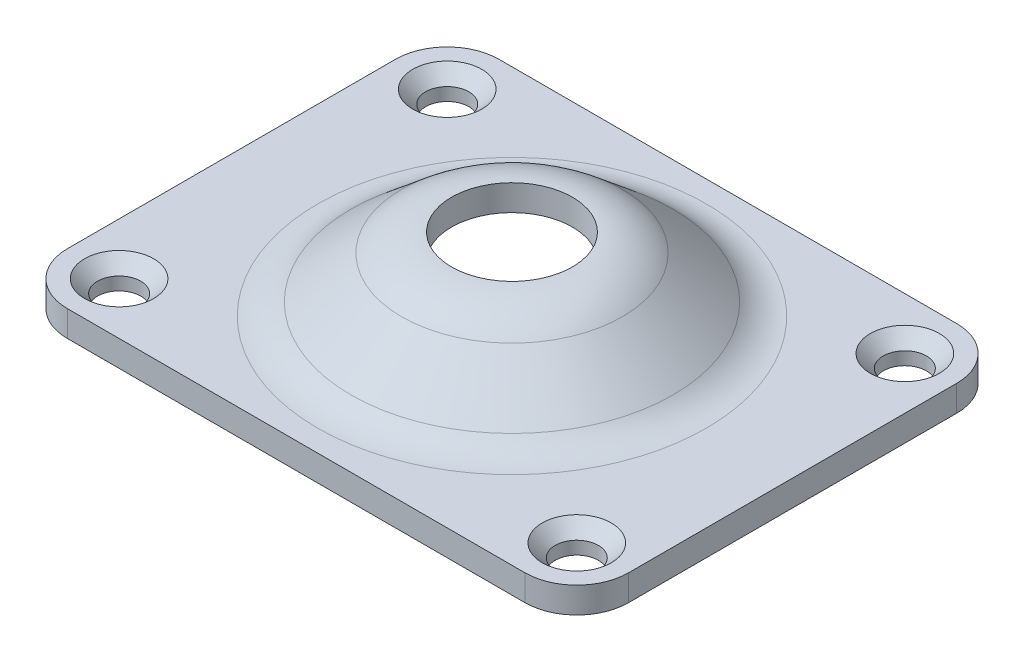
ISO-10303-21;
HEADER;
FILE_DESCRIPTION(('STEP AP214'),'2;1');
FILE_NAME('part.step','',(''),(''),'','','');
FILE_SCHEMA(('AUTOMOTIVE_DESIGN { 1 0 10303 214 1 1 1 1 }'));
ENDSEC;
DATA;
#1=APPLICATION_CONTEXT('core data for automotive mechanical design processes');
#2=APPLICATION_PROTOCOL_DEFINITION('international standard','automotive_design',2000,#1);
#3=PRODUCT_CONTEXT('',#1,'mechanical');
#4=PRODUCT('Part','Part','',(#3));
#5=PRODUCT_RELATED_PRODUCT_CATEGORY('part','',(#4));
#6=PRODUCT_DEFINITION_FORMATION('','',#4);
#7=PRODUCT_DEFINITION_CONTEXT('part definition',#1,'design');
#8=PRODUCT_DEFINITION('design','',#6,#7);
#9=PRODUCT_DEFINITION_SHAPE('','',#8);
#10=(LENGTH_UNIT() NAMED_UNIT(*) SI_UNIT(.MILLI.,.METRE.));
#11=(NAMED_UNIT(*) PLANE_ANGLE_UNIT() SI_UNIT($,.RADIAN.));
#12=(NAMED_UNIT(*) SI_UNIT($,.STERADIAN.) SOLID_ANGLE_UNIT());
#13=UNCERTAINTY_MEASURE_WITH_UNIT(LENGTH_MEASURE(1.E-05),#10,'distance_accuracy_value','');
#14=(GEOMETRIC_REPRESENTATION_CONTEXT(3) GLOBAL_UNCERTAINTY_ASSIGNED_CONTEXT((#13)) GLOBAL_UNIT_ASSIGNED_CONTEXT((#10,
#11,#12)) REPRESENTATION_CONTEXT('',''));
#15=CARTESIAN_POINT('',(0.,0.,0.));
#16=DIRECTION('',(0.,0.,1.));
#17=DIRECTION('',(1.,0.,0.));
#18=AXIS2_PLACEMENT_3D('',#15,#16,#17);
#19=CARTESIAN_POINT('',(26.5,3.,-19.));
#20=DIRECTION('',(0.,-1.,0.));
#21=DIRECTION('',(0.,0.,-1.));
#22=AXIS2_PLACEMENT_3D('',#19,#20,#21);
#23=PLANE('',#22);
#24=CARTESIAN_POINT('',(26.5,3.,19.));
#25=DIRECTION('',(0.,-1.,0.));
#26=DIRECTION('',(0.,0.,-1.));
#27=AXIS2_PLACEMENT_3D('',#24,#25,#26);
#28=CIRCLE('',#27,3.99999999999999);
#29=CARTESIAN_POINT('',(26.5,3.,23.));
#30=VERTEX_POINT('',#29);
#31=EDGE_CURVE('E174',#30,#30,#28,.T.);
#32=ORIENTED_EDGE('',*,*,#31,.T.);
#33=EDGE_LOOP('',(#32));
#34=FACE_BOUND('',#33,.T.);
#35=CARTESIAN_POINT('',(26.5,3.,-19.));
#36=DIRECTION('',(0.,-1.,0.));
#37=DIRECTION('',(0.,0.,-1.));
#38=AXIS2_PLACEMENT_3D('',#35,#36,#37);
#39=CIRCLE('',#38,3.99999999999999);
#40=CARTESIAN_POINT('',(26.5,3.,-15.));
#41=VERTEX_POINT('',#40);
#42=EDGE_CURVE('E171',#41,#41,#39,.T.);
#43=ORIENTED_EDGE('',*,*,#42,.T.);
#44=EDGE_LOOP('',(#43));
#45=FACE_BOUND('',#44,.T.);
#46=CARTESIAN_POINT('',(-26.5,3.,19.));
#47=DIRECTION('',(0.,-1.,0.));
#48=DIRECTION('',(0.,0.,-1.));
#49=AXIS2_PLACEMENT_3D('',#46,#47,#48);
#50=CIRCLE('',#49,3.99999999999999);
#51=CARTESIAN_POINT('',(-26.5,3.,23.));
#52=VERTEX_POINT('',#51);
#53=EDGE_CURVE('E168',#52,#52,#50,.T.);
#54=ORIENTED_EDGE('',*,*,#53,.T.);
#55=EDGE_LOOP('',(#54));
#56=FACE_BOUND('',#55,.T.);
#57=CARTESIAN_POINT('',(-26.5,3.,-19.));
#58=DIRECTION('',(0.,-1.,0.));
#59=DIRECTION('',(0.,0.,-1.));
#60=AXIS2_PLACEMENT_3D('',#57,#58,#59);
#61=CIRCLE('',#60,3.99999999999999);
#62=CARTESIAN_POINT('',(-26.5,3.,-15.));
#63=VERTEX_POINT('',#62);
#64=EDGE_CURVE('E165',#63,#63,#61,.T.);
#65=ORIENTED_EDGE('',*,*,#64,.T.);
#66=EDGE_LOOP('',(#65));
#67=FACE_BOUND('',#66,.T.);
#68=CARTESIAN_POINT('',(26.5,3.,-19.));
#69=DIRECTION('',(0.,1.,0.));
#70=DIRECTION('',(0.,0.,-1.));
#71=AXIS2_PLACEMENT_3D('',#68,#69,#70);
#72=CIRCLE('',#71,6.);
#73=CARTESIAN_POINT('',(32.5,3.,-19.));
#74=VERTEX_POINT('',#73);
#75=CARTESIAN_POINT('',(26.5,3.,-25.));
#76=VERTEX_POINT('',#75);
#77=EDGE_CURVE('E147',#74,#76,#72,.T.);
#78=ORIENTED_EDGE('',*,*,#77,.T.);
#79=DIRECTION('',(-1.,0.,0.));
#80=VECTOR('',#79,1.);
#81=CARTESIAN_POINT('',(-26.5,3.,-25.));
#82=LINE('',#81,#80);
#83=CARTESIAN_POINT('',(-26.5,3.,-25.));
#84=VERTEX_POINT('',#83);
#85=EDGE_CURVE('E95',#76,#84,#82,.T.);
#86=ORIENTED_EDGE('',*,*,#85,.T.);
#87=CARTESIAN_POINT('',(-26.5,3.,-19.));
#88=DIRECTION('',(0.,1.,0.));
#89=DIRECTION('',(0.,0.,-1.));
#90=AXIS2_PLACEMENT_3D('',#87,#88,#89);
#91=CIRCLE('',#90,6.);
#92=CARTESIAN_POINT('',(-32.5,3.,-19.));
#93=VERTEX_POINT('',#92);
#94=EDGE_CURVE('E277',#84,#93,#91,.T.);
#95=ORIENTED_EDGE('',*,*,#94,.T.);
#96=DIRECTION('',(0.,0.,1.));
#97=VECTOR('',#96,1.);
#98=CARTESIAN_POINT('',(-32.5,3.,-19.));
#99=LINE('',#98,#97);
#100=CARTESIAN_POINT('',(-32.5,3.,19.));
#101=VERTEX_POINT('',#100);
#102=EDGE_CURVE('E279',#93,#101,#99,.T.);
#103=ORIENTED_EDGE('',*,*,#102,.T.);
#104=CARTESIAN_POINT('',(-26.5,3.,19.));
#105=DIRECTION('',(0.,1.,0.));
#106=DIRECTION('',(0.,0.,1.));
#107=AXIS2_PLACEMENT_3D('',#104,#105,#106);
#108=CIRCLE('',#107,5.99999999999999);
#109=CARTESIAN_POINT('',(-26.5,3.,25.));
#110=VERTEX_POINT('',#109);
#111=EDGE_CURVE('E114',#101,#110,#108,.T.);
#112=ORIENTED_EDGE('',*,*,#111,.T.);
#113=DIRECTION('',(1.,0.,0.));
#114=VECTOR('',#113,1.);
#115=CARTESIAN_POINT('',(-26.5,3.,25.));
#116=LINE('',#115,#114);
#117=CARTESIAN_POINT('',(26.5,3.,25.));
#118=VERTEX_POINT('',#117);
#119=EDGE_CURVE('E108',#110,#118,#116,.T.);
#120=ORIENTED_EDGE('',*,*,#119,.T.);
#121=CARTESIAN_POINT('',(26.5,3.,19.));
#122=DIRECTION('',(0.,1.,0.));
#123=DIRECTION('',(0.,0.,-1.));
#124=AXIS2_PLACEMENT_3D('',#121,#122,#123);
#125=CIRCLE('',#124,6.);
#126=CARTESIAN_POINT('',(32.5,3.,19.));
#127=VERTEX_POINT('',#126);
#128=EDGE_CURVE('E112',#118,#127,#125,.T.);
#129=ORIENTED_EDGE('',*,*,#128,.T.);
#130=DIRECTION('',(0.,0.,-1.));
#131=VECTOR('',#130,1.);
#132=CARTESIAN_POINT('',(32.5,3.,-19.));
#133=LINE('',#132,#131);
#134=EDGE_CURVE('E51',#127,#74,#133,.T.);
#135=ORIENTED_EDGE('',*,*,#134,.T.);
#136=EDGE_LOOP('',(#78,#86,#95,#103,#112,#120,#129,#135));
#137=FACE_BOUND('',#136,.T.);
#138=CARTESIAN_POINT('',(0.,3.,0.));
#139=DIRECTION('',(0.,1.,0.));
#140=DIRECTION('',(0.,0.,1.));
#141=AXIS2_PLACEMENT_3D('',#138,#139,#140);
#142=CIRCLE('',#141,22.5);
#143=CARTESIAN_POINT('',(0.,3.,22.5));
#144=VERTEX_POINT('',#143);
#145=EDGE_CURVE('E261',#144,#144,#142,.T.);
#146=ORIENTED_EDGE('',*,*,#145,.F.);
#147=EDGE_LOOP('',(#146));
#148=FACE_BOUND('',#147,.T.);
#149=ADVANCED_FACE('F34',(#34,#45,#56,#67,#137,#148),#23,.F.);
#150=CARTESIAN_POINT('',(26.5,0.,-19.));
#151=DIRECTION('',(0.,-1.,0.));
#152=DIRECTION('',(0.,0.,-1.));
#153=AXIS2_PLACEMENT_3D('',#150,#151,#152);
#154=PLANE('',#153);
#155=CARTESIAN_POINT('',(26.5,0.,19.));
#156=DIRECTION('',(0.,1.,0.));
#157=DIRECTION('',(0.,0.,1.));
#158=AXIS2_PLACEMENT_3D('',#155,#156,#157);
#159=CIRCLE('',#158,2.5);
#160=CARTESIAN_POINT('',(26.5,0.,21.5));
#161=VERTEX_POINT('',#160);
#162=EDGE_CURVE('E259',#161,#161,#159,.T.);
#163=ORIENTED_EDGE('',*,*,#162,.T.);
#164=EDGE_LOOP('',(#163));
#165=FACE_BOUND('',#164,.T.);
#166=CARTESIAN_POINT('',(-26.5,0.,19.));
#167=DIRECTION('',(0.,1.,0.));
#168=DIRECTION('',(0.,0.,1.));
#169=AXIS2_PLACEMENT_3D('',#166,#167,#168);
#170=CIRCLE('',#169,2.5);
#171=CARTESIAN_POINT('',(-26.5,0.,21.5));
#172=VERTEX_POINT('',#171);
#173=EDGE_CURVE('E264',#172,#172,#170,.T.);
#174=ORIENTED_EDGE('',*,*,#173,.T.);
#175=EDGE_LOOP('',(#174));
#176=FACE_BOUND('',#175,.T.);
#177=CARTESIAN_POINT('',(26.5,0.,-19.));
#178=DIRECTION('',(0.,1.,0.));
#179=DIRECTION('',(0.,0.,-1.));
#180=AXIS2_PLACEMENT_3D('',#177,#178,#179);
#181=CIRCLE('',#180,6.);
#182=CARTESIAN_POINT('',(32.5,0.,-19.));
#183=VERTEX_POINT('',#182);
#184=CARTESIAN_POINT('',(26.5,0.,-25.));
#185=VERTEX_POINT('',#184);
#186=EDGE_CURVE('E132',#183,#185,#181,.T.);
#187=ORIENTED_EDGE('',*,*,#186,.F.);
#188=DIRECTION('',(0.,0.,-1.));
#189=VECTOR('',#188,1.);
#190=CARTESIAN_POINT('',(32.5,0.,-19.));
#191=LINE('',#190,#189);
#192=CARTESIAN_POINT('',(32.5,0.,19.));
#193=VERTEX_POINT('',#192);
#194=EDGE_CURVE('E86',#193,#183,#191,.T.);
#195=ORIENTED_EDGE('',*,*,#194,.F.);
#196=CARTESIAN_POINT('',(26.5,0.,19.));
#197=DIRECTION('',(0.,1.,0.));
#198=DIRECTION('',(0.,0.,-1.));
#199=AXIS2_PLACEMENT_3D('',#196,#197,#198);
#200=CIRCLE('',#199,6.);
#201=CARTESIAN_POINT('',(26.5,0.,25.));
#202=VERTEX_POINT('',#201);
#203=EDGE_CURVE('E80',#202,#193,#200,.T.);
#204=ORIENTED_EDGE('',*,*,#203,.F.);
#205=DIRECTION('',(1.,0.,0.));
#206=VECTOR('',#205,1.);
#207=CARTESIAN_POINT('',(-26.5,0.,25.));
#208=LINE('',#207,#206);
#209=CARTESIAN_POINT('',(-26.5,0.,25.));
#210=VERTEX_POINT('',#209);
#211=EDGE_CURVE('E122',#210,#202,#208,.T.);
#212=ORIENTED_EDGE('',*,*,#211,.F.);
#213=CARTESIAN_POINT('',(-26.5,0.,19.));
#214=DIRECTION('',(0.,1.,0.));
#215=DIRECTION('',(0.,0.,1.));
#216=AXIS2_PLACEMENT_3D('',#213,#214,#215);
#217=CIRCLE('',#216,5.99999999999999);
#218=CARTESIAN_POINT('',(-32.5,0.,19.));
#219=VERTEX_POINT('',#218);
#220=EDGE_CURVE('E142',#219,#210,#217,.T.);
#221=ORIENTED_EDGE('',*,*,#220,.F.);
#222=DIRECTION('',(0.,0.,1.));
#223=VECTOR('',#222,1.);
#224=CARTESIAN_POINT('',(-32.5,0.,-19.));
#225=LINE('',#224,#223);
#226=CARTESIAN_POINT('',(-32.5,0.,-19.));
#227=VERTEX_POINT('',#226);
#228=EDGE_CURVE('E140',#227,#219,#225,.T.);
#229=ORIENTED_EDGE('',*,*,#228,.F.);
#230=CARTESIAN_POINT('',(-26.5,0.,-19.));
#231=DIRECTION('',(0.,1.,0.));
#232=DIRECTION('',(0.,0.,-1.));
#233=AXIS2_PLACEMENT_3D('',#230,#231,#232);
#234=CIRCLE('',#233,6.);
#235=CARTESIAN_POINT('',(-26.5,0.,-25.));
#236=VERTEX_POINT('',#235);
#237=EDGE_CURVE('E138',#236,#227,#234,.T.);
#238=ORIENTED_EDGE('',*,*,#237,.F.);
#239=DIRECTION('',(-1.,0.,0.));
#240=VECTOR('',#239,1.);
#241=CARTESIAN_POINT('',(-26.5,0.,-25.));
#242=LINE('',#241,#240);
#243=EDGE_CURVE('E135',#185,#236,#242,.T.);
#244=ORIENTED_EDGE('',*,*,#243,.F.);
#245=EDGE_LOOP('',(#187,#195,#204,#212,#221,#229,#238,#244));
#246=FACE_BOUND('',#245,.T.);
#247=CARTESIAN_POINT('',(-26.5,0.,-19.));
#248=DIRECTION('',(0.,1.,0.));
#249=DIRECTION('',(0.,0.,1.));
#250=AXIS2_PLACEMENT_3D('',#247,#248,#249);
#251=CIRCLE('',#250,2.5);
#252=CARTESIAN_POINT('',(-26.5,0.,-16.5));
#253=VERTEX_POINT('',#252);
#254=EDGE_CURVE('E136',#253,#253,#251,.T.);
#255=ORIENTED_EDGE('',*,*,#254,.T.);
#256=EDGE_LOOP('',(#255));
#257=FACE_BOUND('',#256,.T.);
#258=CARTESIAN_POINT('',(26.5,0.,-19.));
#259=DIRECTION('',(0.,1.,0.));
#260=DIRECTION('',(0.,0.,1.));
#261=AXIS2_PLACEMENT_3D('',#258,#259,#260);
#262=CIRCLE('',#261,2.5);
#263=CARTESIAN_POINT('',(26.5,0.,-16.5));
#264=VERTEX_POINT('',#263);
#265=EDGE_CURVE('E260',#264,#264,#262,.T.);
#266=ORIENTED_EDGE('',*,*,#265,.T.);
#267=EDGE_LOOP('',(#266));
#268=FACE_BOUND('',#267,.T.);
#269=CARTESIAN_POINT('',(0.,0.,0.));
#270=DIRECTION('',(0.,1.,0.));
#271=DIRECTION('',(0.,0.,1.));
#272=AXIS2_PLACEMENT_3D('',#269,#270,#271);
#273=CIRCLE('',#272,22.5);
#274=CARTESIAN_POINT('',(0.,0.,22.5));
#275=VERTEX_POINT('',#274);
#276=EDGE_CURVE('E298',#275,#275,#273,.T.);
#277=ORIENTED_EDGE('',*,*,#276,.T.);
#278=EDGE_LOOP('',(#277));
#279=FACE_BOUND('',#278,.T.);
#280=ADVANCED_FACE('F199',(#165,#176,#246,#257,#268,#279),#154,.T.);
#281=CARTESIAN_POINT('',(26.5,3.,-19.));
#282=DIRECTION('',(0.,-1.,0.));
#283=DIRECTION('',(0.,0.,-1.));
#284=AXIS2_PLACEMENT_3D('',#281,#282,#283);
#285=CYLINDRICAL_SURFACE('',#284,6.);
#286=ORIENTED_EDGE('',*,*,#186,.T.);
#287=DIRECTION('',(0.,-1.,0.));
#288=VECTOR('',#287,1.);
#289=CARTESIAN_POINT('',(26.5,3.,-25.));
#290=LINE('',#289,#288);
#291=EDGE_CURVE('E160',#76,#185,#290,.T.);
#292=ORIENTED_EDGE('',*,*,#291,.F.);
#293=ORIENTED_EDGE('',*,*,#77,.F.);
#294=DIRECTION('',(0.,-1.,0.));
#295=VECTOR('',#294,1.);
#296=CARTESIAN_POINT('',(32.5,3.,-19.));
#297=LINE('',#296,#295);
#298=EDGE_CURVE('E128',#74,#183,#297,.T.);
#299=ORIENTED_EDGE('',*,*,#298,.T.);
#300=EDGE_LOOP('',(#286,#292,#293,#299));
#301=FACE_BOUND('',#300,.T.);
#302=ADVANCED_FACE('F205',(#301),#285,.T.);
#303=CARTESIAN_POINT('',(-26.5,3.,-25.));
#304=DIRECTION('',(0.,0.,1.));
#305=DIRECTION('',(1.,0.,0.));
#306=AXIS2_PLACEMENT_3D('',#303,#304,#305);
#307=PLANE('',#306);
#308=ORIENTED_EDGE('',*,*,#243,.T.);
#309=DIRECTION('',(0.,-1.,0.));
#310=VECTOR('',#309,1.);
#311=CARTESIAN_POINT('',(-26.5,3.,-25.));
#312=LINE('',#311,#310);
#313=EDGE_CURVE('E157',#84,#236,#312,.T.);
#314=ORIENTED_EDGE('',*,*,#313,.F.);
#315=ORIENTED_EDGE('',*,*,#85,.F.);
#316=ORIENTED_EDGE('',*,*,#291,.T.);
#317=EDGE_LOOP('',(#308,#314,#315,#316));
#318=FACE_BOUND('',#317,.T.);
#319=ADVANCED_FACE('F231',(#318),#307,.F.);
#320=CARTESIAN_POINT('',(-26.5,3.,-19.));
#321=DIRECTION('',(0.,-1.,0.));
#322=DIRECTION('',(0.,0.,-1.));
#323=AXIS2_PLACEMENT_3D('',#320,#321,#322);
#324=CYLINDRICAL_SURFACE('',#323,6.);
#325=ORIENTED_EDGE('',*,*,#237,.T.);
#326=DIRECTION('',(0.,-1.,0.));
#327=VECTOR('',#326,1.);
#328=CARTESIAN_POINT('',(-32.5,3.,-19.));
#329=LINE('',#328,#327);
#330=EDGE_CURVE('E154',#93,#227,#329,.T.);
#331=ORIENTED_EDGE('',*,*,#330,.F.);
#332=ORIENTED_EDGE('',*,*,#94,.F.);
#333=ORIENTED_EDGE('',*,*,#313,.T.);
#334=EDGE_LOOP('',(#325,#331,#332,#333));
#335=FACE_BOUND('',#334,.T.);
#336=ADVANCED_FACE('F227',(#335),#324,.T.);
#337=CARTESIAN_POINT('',(-32.5,3.,-19.));
#338=DIRECTION('',(1.,0.,0.));
#339=DIRECTION('',(0.,0.,-1.));
#340=AXIS2_PLACEMENT_3D('',#337,#338,#339);
#341=PLANE('',#340);
#342=ORIENTED_EDGE('',*,*,#228,.T.);
#343=DIRECTION('',(0.,-1.,0.));
#344=VECTOR('',#343,1.);
#345=CARTESIAN_POINT('',(-32.5,3.,19.));
#346=LINE('',#345,#344);
#347=EDGE_CURVE('E151',#101,#219,#346,.T.);
#348=ORIENTED_EDGE('',*,*,#347,.F.);
#349=ORIENTED_EDGE('',*,*,#102,.F.);
#350=ORIENTED_EDGE('',*,*,#330,.T.);
#351=EDGE_LOOP('',(#342,#348,#349,#350));
#352=FACE_BOUND('',#351,.T.);
#353=ADVANCED_FACE('F223',(#352),#341,.F.);
#354=CARTESIAN_POINT('',(-26.5,3.,19.));
#355=DIRECTION('',(0.,-1.,0.));
#356=DIRECTION('',(0.,0.,-1.));
#357=AXIS2_PLACEMENT_3D('',#354,#355,#356);
#358=CYLINDRICAL_SURFACE('',#357,5.99999999999999);
#359=ORIENTED_EDGE('',*,*,#220,.T.);
#360=DIRECTION('',(0.,-1.,0.));
#361=VECTOR('',#360,1.);
#362=CARTESIAN_POINT('',(-26.5,3.,25.));
#363=LINE('',#362,#361);
#364=EDGE_CURVE('E123',#110,#210,#363,.T.);
#365=ORIENTED_EDGE('',*,*,#364,.F.);
#366=ORIENTED_EDGE('',*,*,#111,.F.);
#367=ORIENTED_EDGE('',*,*,#347,.T.);
#368=EDGE_LOOP('',(#359,#365,#366,#367));
#369=FACE_BOUND('',#368,.T.);
#370=ADVANCED_FACE('F220',(#369),#358,.T.);
#371=CARTESIAN_POINT('',(-26.5,3.,25.));
#372=DIRECTION('',(0.,0.,-1.));
#373=DIRECTION('',(-1.,0.,0.));
#374=AXIS2_PLACEMENT_3D('',#371,#372,#373);
#375=PLANE('',#374);
#376=ORIENTED_EDGE('',*,*,#211,.T.);
#377=DIRECTION('',(0.,-1.,0.));
#378=VECTOR('',#377,1.);
#379=CARTESIAN_POINT('',(26.5,3.,25.));
#380=LINE('',#379,#378);
#381=EDGE_CURVE('E119',#118,#202,#380,.T.);
#382=ORIENTED_EDGE('',*,*,#381,.F.);
#383=ORIENTED_EDGE('',*,*,#119,.F.);
#384=ORIENTED_EDGE('',*,*,#364,.T.);
#385=EDGE_LOOP('',(#376,#382,#383,#384));
#386=FACE_BOUND('',#385,.T.);
#387=ADVANCED_FACE('F120',(#386),#375,.F.);
#388=CARTESIAN_POINT('',(26.5,3.,19.));
#389=DIRECTION('',(0.,-1.,0.));
#390=DIRECTION('',(0.,0.,-1.));
#391=AXIS2_PLACEMENT_3D('',#388,#389,#390);
#392=CYLINDRICAL_SURFACE('',#391,6.);
#393=ORIENTED_EDGE('',*,*,#203,.T.);
#394=DIRECTION('',(0.,-1.,0.));
#395=VECTOR('',#394,1.);
#396=CARTESIAN_POINT('',(32.5,3.,19.));
#397=LINE('',#396,#395);
#398=EDGE_CURVE('E124',#127,#193,#397,.T.);
#399=ORIENTED_EDGE('',*,*,#398,.F.);
#400=ORIENTED_EDGE('',*,*,#128,.F.);
#401=ORIENTED_EDGE('',*,*,#381,.T.);
#402=EDGE_LOOP('',(#393,#399,#400,#401));
#403=FACE_BOUND('',#402,.T.);
#404=ADVANCED_FACE('F126',(#403),#392,.T.);
#405=CARTESIAN_POINT('',(32.5,3.,-19.));
#406=DIRECTION('',(-1.,0.,0.));
#407=DIRECTION('',(0.,0.,1.));
#408=AXIS2_PLACEMENT_3D('',#405,#406,#407);
#409=PLANE('',#408);
#410=ORIENTED_EDGE('',*,*,#194,.T.);
#411=ORIENTED_EDGE('',*,*,#298,.F.);
#412=ORIENTED_EDGE('',*,*,#134,.F.);
#413=ORIENTED_EDGE('',*,*,#398,.T.);
#414=EDGE_LOOP('',(#410,#411,#412,#413));
#415=FACE_BOUND('',#414,.T.);
#416=ADVANCED_FACE('F213',(#415),#409,.F.);
#417=CARTESIAN_POINT('',(-26.5,3.,-19.));
#418=DIRECTION('',(0.,-1.,0.));
#419=DIRECTION('',(0.,0.,-1.));
#420=AXIS2_PLACEMENT_3D('',#417,#418,#419);
#421=CYLINDRICAL_SURFACE('',#420,2.5);
#422=CARTESIAN_POINT('',(-26.5,1.50000000000001,-19.));
#423=DIRECTION('',(0.,-1.,0.));
#424=DIRECTION('',(0.,0.,-1.));
#425=AXIS2_PLACEMENT_3D('',#422,#423,#424);
#426=CIRCLE('',#425,2.5);
#427=CARTESIAN_POINT('',(-26.5,1.50000000000001,-16.5));
#428=VERTEX_POINT('',#427);
#429=EDGE_CURVE('E11',#428,#428,#426,.F.);
#430=ORIENTED_EDGE('',*,*,#429,.T.);
#431=EDGE_LOOP('',(#430));
#432=FACE_BOUND('',#431,.T.);
#433=ORIENTED_EDGE('',*,*,#254,.F.);
#434=EDGE_LOOP('',(#433));
#435=FACE_BOUND('',#434,.T.);
#436=ADVANCED_FACE('F210',(#432,#435),#421,.F.);
#437=CARTESIAN_POINT('',(-26.5,3.,19.));
#438=DIRECTION('',(0.,-1.,0.));
#439=DIRECTION('',(0.,0.,-1.));
#440=AXIS2_PLACEMENT_3D('',#437,#438,#439);
#441=CYLINDRICAL_SURFACE('',#440,2.5);
#442=CARTESIAN_POINT('',(-26.5,1.50000000000001,19.));
#443=DIRECTION('',(0.,-1.,0.));
#444=DIRECTION('',(0.,0.,-1.));
#445=AXIS2_PLACEMENT_3D('',#442,#443,#444);
#446=CIRCLE('',#445,2.5);
#447=CARTESIAN_POINT('',(-26.5,1.50000000000001,21.5));
#448=VERTEX_POINT('',#447);
#449=EDGE_CURVE('E43',#448,#448,#446,.F.);
#450=ORIENTED_EDGE('',*,*,#449,.T.);
#451=EDGE_LOOP('',(#450));
#452=FACE_BOUND('',#451,.T.);
#453=ORIENTED_EDGE('',*,*,#173,.F.);
#454=EDGE_LOOP('',(#453));
#455=FACE_BOUND('',#454,.T.);
#456=ADVANCED_FACE('F182',(#452,#455),#441,.F.);
#457=CARTESIAN_POINT('',(26.5,3.,-19.));
#458=DIRECTION('',(0.,-1.,0.));
#459=DIRECTION('',(0.,0.,-1.));
#460=AXIS2_PLACEMENT_3D('',#457,#458,#459);
#461=CYLINDRICAL_SURFACE('',#460,2.5);
#462=CARTESIAN_POINT('',(26.5,1.50000000000001,-19.));
#463=DIRECTION('',(0.,-1.,0.));
#464=DIRECTION('',(0.,0.,-1.));
#465=AXIS2_PLACEMENT_3D('',#462,#463,#464);
#466=CIRCLE('',#465,2.5);
#467=CARTESIAN_POINT('',(26.5,1.50000000000001,-16.5));
#468=VERTEX_POINT('',#467);
#469=EDGE_CURVE('E177',#468,#468,#466,.F.);
#470=ORIENTED_EDGE('',*,*,#469,.T.);
#471=EDGE_LOOP('',(#470));
#472=FACE_BOUND('',#471,.T.);
#473=ORIENTED_EDGE('',*,*,#265,.F.);
#474=EDGE_LOOP('',(#473));
#475=FACE_BOUND('',#474,.T.);
#476=ADVANCED_FACE('F255',(#472,#475),#461,.F.);
#477=CARTESIAN_POINT('',(26.5,3.,19.));
#478=DIRECTION('',(0.,-1.,0.));
#479=DIRECTION('',(0.,0.,-1.));
#480=AXIS2_PLACEMENT_3D('',#477,#478,#479);
#481=CYLINDRICAL_SURFACE('',#480,2.5);
#482=CARTESIAN_POINT('',(26.5,1.50000000000001,19.));
#483=DIRECTION('',(0.,-1.,0.));
#484=DIRECTION('',(0.,0.,-1.));
#485=AXIS2_PLACEMENT_3D('',#482,#483,#484);
#486=CIRCLE('',#485,2.5);
#487=CARTESIAN_POINT('',(26.5,1.50000000000001,21.5));
#488=VERTEX_POINT('',#487);
#489=EDGE_CURVE('E162',#488,#488,#486,.F.);
#490=ORIENTED_EDGE('',*,*,#489,.T.);
#491=EDGE_LOOP('',(#490));
#492=FACE_BOUND('',#491,.T.);
#493=ORIENTED_EDGE('',*,*,#162,.F.);
#494=EDGE_LOOP('',(#493));
#495=FACE_BOUND('',#494,.T.);
#496=ADVANCED_FACE('F251',(#492,#495),#481,.F.);
#497=CARTESIAN_POINT('',(0.,2.42493494326361,0.));
#498=DIRECTION('',(0.,1.,0.));
#499=DIRECTION('',(0.,0.,1.));
#500=AXIS2_PLACEMENT_3D('',#497,#498,#499);
#501=DEGENERATE_TOROIDAL_SURFACE('',#500,7.,9.,.T.);
#502=CARTESIAN_POINT('',(0.,9.31933493133444,0.));
#503=DIRECTION('',(0.,1.,0.));
#504=DIRECTION('',(0.,0.,1.));
#505=AXIS2_PLACEMENT_3D('',#502,#503,#504);
#506=CIRCLE('',#505,12.7850884871788);
#507=CARTESIAN_POINT('',(0.,9.31933493133445,12.7850884871788));
#508=VERTEX_POINT('',#507);
#509=EDGE_CURVE('E307',#508,#508,#506,.T.);
#510=ORIENTED_EDGE('',*,*,#509,.T.);
#511=EDGE_LOOP('',(#510));
#512=FACE_BOUND('',#511,.T.);
#513=CARTESIAN_POINT('',(0.,11.4249349432636,0.));
#514=DIRECTION('',(0.,1.,0.));
#515=DIRECTION('',(0.,0.,1.));
#516=AXIS2_PLACEMENT_3D('',#513,#514,#515);
#517=CIRCLE('',#516,7.);
#518=CARTESIAN_POINT('',(0.,11.4249349432636,7.));
#519=VERTEX_POINT('',#518);
#520=EDGE_CURVE('E267',#519,#519,#517,.T.);
#521=ORIENTED_EDGE('',*,*,#520,.F.);
#522=EDGE_LOOP('',(#521));
#523=FACE_BOUND('',#522,.T.);
#524=ADVANCED_FACE('F254',(#512,#523),#501,.T.);
#525=CARTESIAN_POINT('',(0.,0.,0.));
#526=DIRECTION('',(0.,1.,0.));
#527=DIRECTION('',(0.,0.,1.));
#528=AXIS2_PLACEMENT_3D('',#525,#526,#527);
#529=CYLINDRICAL_SURFACE('',#528,7.);
#530=ORIENTED_EDGE('',*,*,#520,.T.);
#531=EDGE_LOOP('',(#530));
#532=FACE_BOUND('',#531,.T.);
#533=CARTESIAN_POINT('',(0.,8.42493494326361,0.));
#534=DIRECTION('',(0.,1.,0.));
#535=DIRECTION('',(0.,0.,1.));
#536=AXIS2_PLACEMENT_3D('',#533,#534,#535);
#537=CIRCLE('',#536,7.);
#538=CARTESIAN_POINT('',(0.,8.42493494326361,7.));
#539=VERTEX_POINT('',#538);
#540=EDGE_CURVE('E313',#539,#539,#537,.T.);
#541=ORIENTED_EDGE('',*,*,#540,.F.);
#542=EDGE_LOOP('',(#541));
#543=FACE_BOUND('',#542,.T.);
#544=ADVANCED_FACE('F318',(#532,#543),#529,.F.);
#545=CARTESIAN_POINT('',(0.,2.42493494326361,0.));
#546=DIRECTION('',(0.,1.,0.));
#547=DIRECTION('',(0.,0.,1.));
#548=AXIS2_PLACEMENT_3D('',#545,#546,#547);
#549=TOROIDAL_SURFACE('',#548,7.,6.);
#550=ORIENTED_EDGE('',*,*,#540,.T.);
#551=EDGE_LOOP('',(#550));
#552=FACE_BOUND('',#551,.T.);
#553=CARTESIAN_POINT('',(0.,7.0212016019775,0.));
#554=DIRECTION('',(0.,1.,0.));
#555=DIRECTION('',(0.,0.,1.));
#556=AXIS2_PLACEMENT_3D('',#553,#554,#555);
#557=CIRCLE('',#556,10.8567256581192);
#558=CARTESIAN_POINT('',(0.,7.0212016019775,10.8567256581192));
#559=VERTEX_POINT('',#558);
#560=EDGE_CURVE('E304',#559,#559,#557,.T.);
#561=ORIENTED_EDGE('',*,*,#560,.F.);
#562=EDGE_LOOP('',(#561));
#563=FACE_BOUND('',#562,.T.);
#564=ADVANCED_FACE('F327',(#552,#563),#549,.F.);
#565=CARTESIAN_POINT('',(0.,2.10560001192917,0.));
#566=DIRECTION('',(0.,-1.,0.));
#567=DIRECTION('',(0.,0.,-1.));
#568=AXIS2_PLACEMENT_3D('',#565,#566,#567);
#569=CONICAL_SURFACE('',#568,16.7149115128212,0.87266462599717);
#570=ORIENTED_EDGE('',*,*,#560,.T.);
#571=EDGE_LOOP('',(#570));
#572=FACE_BOUND('',#571,.T.);
#573=CARTESIAN_POINT('',(0.,2.10560001192917,0.));
#574=DIRECTION('',(0.,1.,0.));
#575=DIRECTION('',(0.,0.,1.));
#576=AXIS2_PLACEMENT_3D('',#573,#574,#575);
#577=CIRCLE('',#576,16.7149115128212);
#578=CARTESIAN_POINT('',(0.,2.10560001192917,16.7149115128212));
#579=VERTEX_POINT('',#578);
#580=EDGE_CURVE('E300',#579,#579,#577,.T.);
#581=ORIENTED_EDGE('',*,*,#580,.F.);
#582=EDGE_LOOP('',(#581));
#583=FACE_BOUND('',#582,.T.);
#584=ADVANCED_FACE('F434',(#572,#583),#569,.F.);
#585=CARTESIAN_POINT('',(0.,9.00000000000001,0.));
#586=DIRECTION('',(0.,1.,0.));
#587=DIRECTION('',(0.,0.,1.));
#588=AXIS2_PLACEMENT_3D('',#585,#586,#587);
#589=TOROIDAL_SURFACE('',#588,22.5,9.);
#590=ORIENTED_EDGE('',*,*,#580,.T.);
#591=EDGE_LOOP('',(#590));
#592=FACE_BOUND('',#591,.T.);
#593=ORIENTED_EDGE('',*,*,#276,.F.);
#594=EDGE_LOOP('',(#593));
#595=FACE_BOUND('',#594,.T.);
#596=ADVANCED_FACE('F442',(#592,#595),#589,.T.);
#597=CARTESIAN_POINT('',(0.,9.00000000000001,0.));
#598=DIRECTION('',(0.,1.,0.));
#599=DIRECTION('',(0.,0.,1.));
#600=AXIS2_PLACEMENT_3D('',#597,#598,#599);
#601=TOROIDAL_SURFACE('',#600,22.5,6.);
#602=ORIENTED_EDGE('',*,*,#145,.T.);
#603=EDGE_LOOP('',(#602));
#604=FACE_BOUND('',#603,.T.);
#605=CARTESIAN_POINT('',(0.,4.40373334128611,0.));
#606=DIRECTION('',(0.,1.,0.));
#607=DIRECTION('',(0.,0.,1.));
#608=AXIS2_PLACEMENT_3D('',#605,#606,#607);
#609=CIRCLE('',#608,18.6432743418808);
#610=CARTESIAN_POINT('',(0.,4.40373334128612,18.6432743418808));
#611=VERTEX_POINT('',#610);
#612=EDGE_CURVE('E301',#611,#611,#609,.T.);
#613=ORIENTED_EDGE('',*,*,#612,.F.);
#614=EDGE_LOOP('',(#613));
#615=FACE_BOUND('',#614,.T.);
#616=ADVANCED_FACE('F244',(#604,#615),#601,.F.);
#617=CARTESIAN_POINT('',(0.,9.31933493133444,0.));
#618=DIRECTION('',(0.,-1.,0.));
#619=DIRECTION('',(0.,0.,-1.));
#620=AXIS2_PLACEMENT_3D('',#617,#618,#619);
#621=CONICAL_SURFACE('',#620,12.7850884871788,0.872664625997171);
#622=ORIENTED_EDGE('',*,*,#612,.T.);
#623=EDGE_LOOP('',(#622));
#624=FACE_BOUND('',#623,.T.);
#625=ORIENTED_EDGE('',*,*,#509,.F.);
#626=EDGE_LOOP('',(#625));
#627=FACE_BOUND('',#626,.T.);
#628=ADVANCED_FACE('F239',(#624,#627),#621,.T.);
#629=CARTESIAN_POINT('',(26.5,1.50000000000001,19.));
#630=DIRECTION('',(0.,1.,0.));
#631=DIRECTION('',(0.,0.,1.));
#632=AXIS2_PLACEMENT_3D('',#629,#630,#631);
#633=CONICAL_SURFACE('',#632,2.5,0.785398163397448);
#634=CARTESIAN_POINT('',(26.5,3.,23.));
#635=CARTESIAN_POINT('',(26.5,2.984375,22.984375));
#636=CARTESIAN_POINT('',(26.5,2.96875,22.96875));
#637=CARTESIAN_POINT('',(26.5,2.9375,22.9375));
#638=CARTESIAN_POINT('',(26.5,2.921875,22.921875));
#639=CARTESIAN_POINT('',(26.5,2.890625,22.890625));
#640=CARTESIAN_POINT('',(26.5,2.875,22.875));
#641=CARTESIAN_POINT('',(26.5,2.84375,22.84375));
#642=CARTESIAN_POINT('',(26.5,2.828125,22.828125));
#643=CARTESIAN_POINT('',(26.5,2.796875,22.796875));
#644=CARTESIAN_POINT('',(26.5,2.78125,22.78125));
#645=CARTESIAN_POINT('',(26.5,2.75,22.75));
#646=CARTESIAN_POINT('',(26.5,2.734375,22.734375));
#647=CARTESIAN_POINT('',(26.5,2.703125,22.703125));
#648=CARTESIAN_POINT('',(26.5,2.6875,22.6875));
#649=CARTESIAN_POINT('',(26.5,2.65625,22.65625));
#650=CARTESIAN_POINT('',(26.5,2.640625,22.640625));
#651=CARTESIAN_POINT('',(26.5,2.609375,22.609375));
#652=CARTESIAN_POINT('',(26.5,2.59375,22.59375));
#653=CARTESIAN_POINT('',(26.5,2.5625,22.5625));
#654=CARTESIAN_POINT('',(26.5,2.546875,22.546875));
#655=CARTESIAN_POINT('',(26.5,2.515625,22.515625));
#656=CARTESIAN_POINT('',(26.5,2.5,22.5));
#657=CARTESIAN_POINT('',(26.5,2.46875,22.46875));
#658=CARTESIAN_POINT('',(26.5,2.453125,22.453125));
#659=CARTESIAN_POINT('',(26.5,2.421875,22.421875));
#660=CARTESIAN_POINT('',(26.5,2.40625,22.40625));
#661=CARTESIAN_POINT('',(26.5,2.375,22.375));
#662=CARTESIAN_POINT('',(26.5,2.359375,22.359375));
#663=CARTESIAN_POINT('',(26.5,2.328125,22.328125));
#664=CARTESIAN_POINT('',(26.5,2.3125,22.3125));
#665=CARTESIAN_POINT('',(26.5,2.28125,22.28125));
#666=CARTESIAN_POINT('',(26.5,2.265625,22.265625));
#667=CARTESIAN_POINT('',(26.5,2.234375,22.234375));
#668=CARTESIAN_POINT('',(26.5,2.21875,22.21875));
#669=CARTESIAN_POINT('',(26.5,2.1875,22.1875));
#670=CARTESIAN_POINT('',(26.5,2.171875,22.171875));
#671=CARTESIAN_POINT('',(26.5,2.140625,22.140625));
#672=CARTESIAN_POINT('',(26.5,2.125,22.125));
#673=CARTESIAN_POINT('',(26.5,2.09375,22.09375));
#674=CARTESIAN_POINT('',(26.5,2.078125,22.078125));
#675=CARTESIAN_POINT('',(26.5,2.046875,22.046875));
#676=CARTESIAN_POINT('',(26.5,2.03125,22.03125));
#677=CARTESIAN_POINT('',(26.5,2.00000000000001,22.));
#678=CARTESIAN_POINT('',(26.5,1.98437500000001,21.984375));
#679=CARTESIAN_POINT('',(26.5,1.95312500000001,21.953125));
#680=CARTESIAN_POINT('',(26.5,1.9375,21.9375));
#681=CARTESIAN_POINT('',(26.5,1.90625000000001,21.90625));
#682=CARTESIAN_POINT('',(26.5,1.89062500000001,21.890625));
#683=CARTESIAN_POINT('',(26.5,1.85937500000001,21.859375));
#684=CARTESIAN_POINT('',(26.5,1.84375000000001,21.84375));
#685=CARTESIAN_POINT('',(26.5,1.81250000000001,21.8125));
#686=CARTESIAN_POINT('',(26.5,1.79687500000001,21.796875));
#687=CARTESIAN_POINT('',(26.5,1.76562500000001,21.765625));
#688=CARTESIAN_POINT('',(26.5,1.75000000000001,21.75));
#689=CARTESIAN_POINT('',(26.5,1.71875000000001,21.71875));
#690=CARTESIAN_POINT('',(26.5,1.70312500000001,21.703125));
#691=CARTESIAN_POINT('',(26.5,1.67187500000001,21.671875));
#692=CARTESIAN_POINT('',(26.5,1.65625000000001,21.65625));
#693=CARTESIAN_POINT('',(26.5,1.62500000000001,21.625));
#694=CARTESIAN_POINT('',(26.5,1.60937500000001,21.609375));
#695=CARTESIAN_POINT('',(26.5,1.57812500000001,21.578125));
#696=CARTESIAN_POINT('',(26.5,1.56250000000001,21.5625));
#697=CARTESIAN_POINT('',(26.5,1.53125000000001,21.53125));
#698=CARTESIAN_POINT('',(26.5,1.51562500000001,21.515625));
#699=CARTESIAN_POINT('',(26.5,1.50000000000001,21.5));
#700=B_SPLINE_CURVE_WITH_KNOTS('',3,(#634,#635,#636,#637,#638,#639,#640,#641,#642,#643,#644,
#645,#646,#647,#648,#649,#650,#651,#652,#653,#654,#655,#656,#657,#658,#659,#660,#661,#662,#663,
#664,#665,#666,#667,#668,#669,#670,#671,#672,#673,#674,#675,#676,#677,#678,#679,#680,#681,#682,
#683,#684,#685,#686,#687,#688,#689,#690,#691,#692,#693,#694,#695,#696,#697,#698,#699),
.UNSPECIFIED.,.F.,.F.,(4,2,2,2,2,2,2,2,2,2,2,2,2,2,2,2,2,2,2,2,2,2,2,2,2,2,2,2,2,2,2,2,4),(0.,
0.0662912607362374,0.132582521472477,0.198873782208715,0.265165042944955,0.331456303681192,
0.39774756441743,0.46403882515367,0.530330085889907,0.596621346626144,0.662912607362385,
0.729203868098622,0.795495128834862,0.861786389571099,0.928077650307339,0.994368911043576,
1.06066017177981,1.12695143251605,1.19324269325229,1.25953395398853,1.32582521472477,
1.39211647546101,1.45840773619725,1.52469899693348,1.59099025766972,1.65728151840596,
1.7235727791422,1.78986403987844,1.85615530061468,1.92244656135092,1.98873782208715,
2.05502908282339,2.12132034355963),.UNSPECIFIED.);
#701=EDGE_CURVE('BSEAM194',#30,#488,#700,.T.);
#702=ORIENTED_EDGE('',*,*,#31,.F.);
#703=ORIENTED_EDGE('',*,*,#489,.F.);
#704=ORIENTED_EDGE('',*,*,#701,.T.);
#705=ORIENTED_EDGE('',*,*,#701,.F.);
#706=EDGE_LOOP('',(#702,#704,#703,#705));
#707=FACE_BOUND('',#706,.T.);
#708=ADVANCED_FACE('F194',(#707),#633,.F.);
#709=CARTESIAN_POINT('',(26.5,1.50000000000001,-19.));
#710=DIRECTION('',(0.,1.,0.));
#711=DIRECTION('',(0.,0.,1.));
#712=AXIS2_PLACEMENT_3D('',#709,#710,#711);
#713=CONICAL_SURFACE('',#712,2.5,0.785398163397448);
#714=CARTESIAN_POINT('',(26.5,3.,-15.));
#715=CARTESIAN_POINT('',(26.5,2.984375,-15.015625));
#716=CARTESIAN_POINT('',(26.5,2.96875,-15.03125));
#717=CARTESIAN_POINT('',(26.5,2.9375,-15.0625));
#718=CARTESIAN_POINT('',(26.5,2.921875,-15.078125));
#719=CARTESIAN_POINT('',(26.5,2.890625,-15.109375));
#720=CARTESIAN_POINT('',(26.5,2.875,-15.125));
#721=CARTESIAN_POINT('',(26.5,2.84375,-15.15625));
#722=CARTESIAN_POINT('',(26.5,2.828125,-15.171875));
#723=CARTESIAN_POINT('',(26.5,2.796875,-15.203125));
#724=CARTESIAN_POINT('',(26.5,2.78125,-15.21875));
#725=CARTESIAN_POINT('',(26.5,2.75,-15.25));
#726=CARTESIAN_POINT('',(26.5,2.734375,-15.265625));
#727=CARTESIAN_POINT('',(26.5,2.703125,-15.296875));
#728=CARTESIAN_POINT('',(26.5,2.6875,-15.3125));
#729=CARTESIAN_POINT('',(26.5,2.65625,-15.34375));
#730=CARTESIAN_POINT('',(26.5,2.640625,-15.359375));
#731=CARTESIAN_POINT('',(26.5,2.609375,-15.390625));
#732=CARTESIAN_POINT('',(26.5,2.59375,-15.40625));
#733=CARTESIAN_POINT('',(26.5,2.5625,-15.4375));
#734=CARTESIAN_POINT('',(26.5,2.546875,-15.453125));
#735=CARTESIAN_POINT('',(26.5,2.515625,-15.484375));
#736=CARTESIAN_POINT('',(26.5,2.5,-15.5));
#737=CARTESIAN_POINT('',(26.5,2.46875,-15.53125));
#738=CARTESIAN_POINT('',(26.5,2.453125,-15.546875));
#739=CARTESIAN_POINT('',(26.5,2.421875,-15.578125));
#740=CARTESIAN_POINT('',(26.5,2.40625,-15.59375));
#741=CARTESIAN_POINT('',(26.5,2.375,-15.625));
#742=CARTESIAN_POINT('',(26.5,2.359375,-15.640625));
#743=CARTESIAN_POINT('',(26.5,2.328125,-15.671875));
#744=CARTESIAN_POINT('',(26.5,2.3125,-15.6875));
#745=CARTESIAN_POINT('',(26.5,2.28125,-15.71875));
#746=CARTESIAN_POINT('',(26.5,2.265625,-15.734375));
#747=CARTESIAN_POINT('',(26.5,2.234375,-15.765625));
#748=CARTESIAN_POINT('',(26.5,2.21875,-15.78125));
#749=CARTESIAN_POINT('',(26.5,2.1875,-15.8125));
#750=CARTESIAN_POINT('',(26.5,2.171875,-15.828125));
#751=CARTESIAN_POINT('',(26.5,2.140625,-15.859375));
#752=CARTESIAN_POINT('',(26.5,2.125,-15.875));
#753=CARTESIAN_POINT('',(26.5,2.09375,-15.90625));
#754=CARTESIAN_POINT('',(26.5,2.078125,-15.921875));
#755=CARTESIAN_POINT('',(26.5,2.046875,-15.953125));
#756=CARTESIAN_POINT('',(26.5,2.03125,-15.96875));
#757=CARTESIAN_POINT('',(26.5,2.00000000000001,-16.));
#758=CARTESIAN_POINT('',(26.5,1.98437500000001,-16.015625));
#759=CARTESIAN_POINT('',(26.5,1.95312500000001,-16.046875));
#760=CARTESIAN_POINT('',(26.5,1.9375,-16.0625));
#761=CARTESIAN_POINT('',(26.5,1.90625000000001,-16.09375));
#762=CARTESIAN_POINT('',(26.5,1.89062500000001,-16.109375));
#763=CARTESIAN_POINT('',(26.5,1.85937500000001,-16.140625));
#764=CARTESIAN_POINT('',(26.5,1.84375000000001,-16.15625));
#765=CARTESIAN_POINT('',(26.5,1.81250000000001,-16.1875));
#766=CARTESIAN_POINT('',(26.5,1.79687500000001,-16.203125));
#767=CARTESIAN_POINT('',(26.5,1.76562500000001,-16.234375));
#768=CARTESIAN_POINT('',(26.5,1.75000000000001,-16.25));
#769=CARTESIAN_POINT('',(26.5,1.71875000000001,-16.28125));
#770=CARTESIAN_POINT('',(26.5,1.70312500000001,-16.296875));
#771=CARTESIAN_POINT('',(26.5,1.67187500000001,-16.328125));
#772=CARTESIAN_POINT('',(26.5,1.65625000000001,-16.34375));
#773=CARTESIAN_POINT('',(26.5,1.62500000000001,-16.375));
#774=CARTESIAN_POINT('',(26.5,1.60937500000001,-16.390625));
#775=CARTESIAN_POINT('',(26.5,1.57812500000001,-16.421875));
#776=CARTESIAN_POINT('',(26.5,1.56250000000001,-16.4375));
#777=CARTESIAN_POINT('',(26.5,1.53125000000001,-16.46875));
#778=CARTESIAN_POINT('',(26.5,1.51562500000001,-16.484375));
#779=CARTESIAN_POINT('',(26.5,1.50000000000001,-16.5));
#780=B_SPLINE_CURVE_WITH_KNOTS('',3,(#714,#715,#716,#717,#718,#719,#720,#721,#722,#723,#724,
#725,#726,#727,#728,#729,#730,#731,#732,#733,#734,#735,#736,#737,#738,#739,#740,#741,#742,#743,
#744,#745,#746,#747,#748,#749,#750,#751,#752,#753,#754,#755,#756,#757,#758,#759,#760,#761,#762,
#763,#764,#765,#766,#767,#768,#769,#770,#771,#772,#773,#774,#775,#776,#777,#778,#779),
.UNSPECIFIED.,.F.,.F.,(4,2,2,2,2,2,2,2,2,2,2,2,2,2,2,2,2,2,2,2,2,2,2,2,2,2,2,2,2,2,2,2,4),(0.,
0.0662912607362374,0.132582521472477,0.198873782208715,0.265165042944953,0.331456303681192,
0.39774756441743,0.46403882515367,0.530330085889907,0.596621346626146,0.662912607362385,
0.729203868098623,0.795495128834862,0.861786389571099,0.928077650307339,0.994368911043576,
1.06066017177981,1.12695143251605,1.19324269325229,1.25953395398853,1.32582521472477,
1.39211647546101,1.45840773619725,1.52469899693348,1.59099025766972,1.65728151840596,
1.7235727791422,1.78986403987844,1.85615530061468,1.92244656135092,1.98873782208715,
2.05502908282339,2.12132034355963),.UNSPECIFIED.);
#781=EDGE_CURVE('BSEAM187',#41,#468,#780,.T.);
#782=ORIENTED_EDGE('',*,*,#42,.F.);
#783=ORIENTED_EDGE('',*,*,#469,.F.);
#784=ORIENTED_EDGE('',*,*,#781,.T.);
#785=ORIENTED_EDGE('',*,*,#781,.F.);
#786=EDGE_LOOP('',(#782,#784,#783,#785));
#787=FACE_BOUND('',#786,.T.);
#788=ADVANCED_FACE('F187',(#787),#713,.F.);
#789=CARTESIAN_POINT('',(-26.5,1.50000000000001,19.));
#790=DIRECTION('',(0.,1.,0.));
#791=DIRECTION('',(0.,0.,1.));
#792=AXIS2_PLACEMENT_3D('',#789,#790,#791);
#793=CONICAL_SURFACE('',#792,2.5,0.785398163397448);
#794=CARTESIAN_POINT('',(-26.5,3.,23.));
#795=CARTESIAN_POINT('',(-26.5,2.984375,22.984375));
#796=CARTESIAN_POINT('',(-26.5,2.96875,22.96875));
#797=CARTESIAN_POINT('',(-26.5,2.9375,22.9375));
#798=CARTESIAN_POINT('',(-26.5,2.921875,22.921875));
#799=CARTESIAN_POINT('',(-26.5,2.890625,22.890625));
#800=CARTESIAN_POINT('',(-26.5,2.875,22.875));
#801=CARTESIAN_POINT('',(-26.5,2.84375,22.84375));
#802=CARTESIAN_POINT('',(-26.5,2.828125,22.828125));
#803=CARTESIAN_POINT('',(-26.5,2.796875,22.796875));
#804=CARTESIAN_POINT('',(-26.5,2.78125,22.78125));
#805=CARTESIAN_POINT('',(-26.5,2.75,22.75));
#806=CARTESIAN_POINT('',(-26.5,2.734375,22.734375));
#807=CARTESIAN_POINT('',(-26.5,2.703125,22.703125));
#808=CARTESIAN_POINT('',(-26.5,2.6875,22.6875));
#809=CARTESIAN_POINT('',(-26.5,2.65625,22.65625));
#810=CARTESIAN_POINT('',(-26.5,2.640625,22.640625));
#811=CARTESIAN_POINT('',(-26.5,2.609375,22.609375));
#812=CARTESIAN_POINT('',(-26.5,2.59375,22.59375));
#813=CARTESIAN_POINT('',(-26.5,2.5625,22.5625));
#814=CARTESIAN_POINT('',(-26.5,2.546875,22.546875));
#815=CARTESIAN_POINT('',(-26.5,2.515625,22.515625));
#816=CARTESIAN_POINT('',(-26.5,2.5,22.5));
#817=CARTESIAN_POINT('',(-26.5,2.46875,22.46875));
#818=CARTESIAN_POINT('',(-26.5,2.453125,22.453125));
#819=CARTESIAN_POINT('',(-26.5,2.421875,22.421875));
#820=CARTESIAN_POINT('',(-26.5,2.40625,22.40625));
#821=CARTESIAN_POINT('',(-26.5,2.375,22.375));
#822=CARTESIAN_POINT('',(-26.5,2.359375,22.359375));
#823=CARTESIAN_POINT('',(-26.5,2.328125,22.328125));
#824=CARTESIAN_POINT('',(-26.5,2.3125,22.3125));
#825=CARTESIAN_POINT('',(-26.5,2.28125,22.28125));
#826=CARTESIAN_POINT('',(-26.5,2.265625,22.265625));
#827=CARTESIAN_POINT('',(-26.5,2.234375,22.234375));
#828=CARTESIAN_POINT('',(-26.5,2.21875,22.21875));
#829=CARTESIAN_POINT('',(-26.5,2.1875,22.1875));
#830=CARTESIAN_POINT('',(-26.5,2.171875,22.171875));
#831=CARTESIAN_POINT('',(-26.5,2.140625,22.140625));
#832=CARTESIAN_POINT('',(-26.5,2.125,22.125));
#833=CARTESIAN_POINT('',(-26.5,2.09375,22.09375));
#834=CARTESIAN_POINT('',(-26.5,2.078125,22.078125));
#835=CARTESIAN_POINT('',(-26.5,2.046875,22.046875));
#836=CARTESIAN_POINT('',(-26.5,2.03125,22.03125));
#837=CARTESIAN_POINT('',(-26.5,2.00000000000001,22.));
#838=CARTESIAN_POINT('',(-26.5,1.98437500000001,21.984375));
#839=CARTESIAN_POINT('',(-26.5,1.95312500000001,21.953125));
#840=CARTESIAN_POINT('',(-26.5,1.9375,21.9375));
#841=CARTESIAN_POINT('',(-26.5,1.90625000000001,21.90625));
#842=CARTESIAN_POINT('',(-26.5,1.89062500000001,21.890625));
#843=CARTESIAN_POINT('',(-26.5,1.85937500000001,21.859375));
#844=CARTESIAN_POINT('',(-26.5,1.84375000000001,21.84375));
#845=CARTESIAN_POINT('',(-26.5,1.81250000000001,21.8125));
#846=CARTESIAN_POINT('',(-26.5,1.79687500000001,21.796875));
#847=CARTESIAN_POINT('',(-26.5,1.76562500000001,21.765625));
#848=CARTESIAN_POINT('',(-26.5,1.75000000000001,21.75));
#849=CARTESIAN_POINT('',(-26.5,1.71875000000001,21.71875));
#850=CARTESIAN_POINT('',(-26.5,1.70312500000001,21.703125));
#851=CARTESIAN_POINT('',(-26.5,1.67187500000001,21.671875));
#852=CARTESIAN_POINT('',(-26.5,1.65625000000001,21.65625));
#853=CARTESIAN_POINT('',(-26.5,1.62500000000001,21.625));
#854=CARTESIAN_POINT('',(-26.5,1.60937500000001,21.609375));
#855=CARTESIAN_POINT('',(-26.5,1.57812500000001,21.578125));
#856=CARTESIAN_POINT('',(-26.5,1.56250000000001,21.5625));
#857=CARTESIAN_POINT('',(-26.5,1.53125000000001,21.53125));
#858=CARTESIAN_POINT('',(-26.5,1.51562500000001,21.515625));
#859=CARTESIAN_POINT('',(-26.5,1.50000000000001,21.5));
#860=B_SPLINE_CURVE_WITH_KNOTS('',3,(#794,#795,#796,#797,#798,#799,#800,#801,#802,#803,#804,
#805,#806,#807,#808,#809,#810,#811,#812,#813,#814,#815,#816,#817,#818,#819,#820,#821,#822,#823,
#824,#825,#826,#827,#828,#829,#830,#831,#832,#833,#834,#835,#836,#837,#838,#839,#840,#841,#842,
#843,#844,#845,#846,#847,#848,#849,#850,#851,#852,#853,#854,#855,#856,#857,#858,#859),
.UNSPECIFIED.,.F.,.F.,(4,2,2,2,2,2,2,2,2,2,2,2,2,2,2,2,2,2,2,2,2,2,2,2,2,2,2,2,2,2,2,2,4),(0.,
0.0662912607362374,0.132582521472477,0.198873782208715,0.265165042944955,0.331456303681192,
0.39774756441743,0.46403882515367,0.530330085889907,0.596621346626144,0.662912607362385,
0.729203868098622,0.795495128834862,0.861786389571099,0.928077650307339,0.994368911043576,
1.06066017177981,1.12695143251605,1.19324269325229,1.25953395398853,1.32582521472477,
1.39211647546101,1.45840773619725,1.52469899693348,1.59099025766972,1.65728151840596,
1.7235727791422,1.78986403987844,1.85615530061468,1.92244656135092,1.98873782208715,
2.05502908282339,2.12132034355963),.UNSPECIFIED.);
#861=EDGE_CURVE('BSEAM185',#52,#448,#860,.T.);
#862=ORIENTED_EDGE('',*,*,#53,.F.);
#863=ORIENTED_EDGE('',*,*,#449,.F.);
#864=ORIENTED_EDGE('',*,*,#861,.T.);
#865=ORIENTED_EDGE('',*,*,#861,.F.);
#866=EDGE_LOOP('',(#862,#864,#863,#865));
#867=FACE_BOUND('',#866,.T.);
#868=ADVANCED_FACE('F185',(#867),#793,.F.);
#869=CARTESIAN_POINT('',(-26.5,1.50000000000001,-19.));
#870=DIRECTION('',(0.,1.,0.));
#871=DIRECTION('',(0.,0.,1.));
#872=AXIS2_PLACEMENT_3D('',#869,#870,#871);
#873=CONICAL_SURFACE('',#872,2.5,0.785398163397448);
#874=CARTESIAN_POINT('',(-26.5,3.,-15.));
#875=CARTESIAN_POINT('',(-26.5,2.984375,-15.015625));
#876=CARTESIAN_POINT('',(-26.5,2.96875,-15.03125));
#877=CARTESIAN_POINT('',(-26.5,2.9375,-15.0625));
#878=CARTESIAN_POINT('',(-26.5,2.921875,-15.078125));
#879=CARTESIAN_POINT('',(-26.5,2.890625,-15.109375));
#880=CARTESIAN_POINT('',(-26.5,2.875,-15.125));
#881=CARTESIAN_POINT('',(-26.5,2.84375,-15.15625));
#882=CARTESIAN_POINT('',(-26.5,2.828125,-15.171875));
#883=CARTESIAN_POINT('',(-26.5,2.796875,-15.203125));
#884=CARTESIAN_POINT('',(-26.5,2.78125,-15.21875));
#885=CARTESIAN_POINT('',(-26.5,2.75,-15.25));
#886=CARTESIAN_POINT('',(-26.5,2.734375,-15.265625));
#887=CARTESIAN_POINT('',(-26.5,2.703125,-15.296875));
#888=CARTESIAN_POINT('',(-26.5,2.6875,-15.3125));
#889=CARTESIAN_POINT('',(-26.5,2.65625,-15.34375));
#890=CARTESIAN_POINT('',(-26.5,2.640625,-15.359375));
#891=CARTESIAN_POINT('',(-26.5,2.609375,-15.390625));
#892=CARTESIAN_POINT('',(-26.5,2.59375,-15.40625));
#893=CARTESIAN_POINT('',(-26.5,2.5625,-15.4375));
#894=CARTESIAN_POINT('',(-26.5,2.546875,-15.453125));
#895=CARTESIAN_POINT('',(-26.5,2.515625,-15.484375));
#896=CARTESIAN_POINT('',(-26.5,2.5,-15.5));
#897=CARTESIAN_POINT('',(-26.5,2.46875,-15.53125));
#898=CARTESIAN_POINT('',(-26.5,2.453125,-15.546875));
#899=CARTESIAN_POINT('',(-26.5,2.421875,-15.578125));
#900=CARTESIAN_POINT('',(-26.5,2.40625,-15.59375));
#901=CARTESIAN_POINT('',(-26.5,2.375,-15.625));
#902=CARTESIAN_POINT('',(-26.5,2.359375,-15.640625));
#903=CARTESIAN_POINT('',(-26.5,2.328125,-15.671875));
#904=CARTESIAN_POINT('',(-26.5,2.3125,-15.6875));
#905=CARTESIAN_POINT('',(-26.5,2.28125,-15.71875));
#906=CARTESIAN_POINT('',(-26.5,2.265625,-15.734375));
#907=CARTESIAN_POINT('',(-26.5,2.234375,-15.765625));
#908=CARTESIAN_POINT('',(-26.5,2.21875,-15.78125));
#909=CARTESIAN_POINT('',(-26.5,2.1875,-15.8125));
#910=CARTESIAN_POINT('',(-26.5,2.171875,-15.828125));
#911=CARTESIAN_POINT('',(-26.5,2.140625,-15.859375));
#912=CARTESIAN_POINT('',(-26.5,2.125,-15.875));
#913=CARTESIAN_POINT('',(-26.5,2.09375,-15.90625));
#914=CARTESIAN_POINT('',(-26.5,2.078125,-15.921875));
#915=CARTESIAN_POINT('',(-26.5,2.046875,-15.953125));
#916=CARTESIAN_POINT('',(-26.5,2.03125,-15.96875));
#917=CARTESIAN_POINT('',(-26.5,2.00000000000001,-16.));
#918=CARTESIAN_POINT('',(-26.5,1.98437500000001,-16.015625));
#919=CARTESIAN_POINT('',(-26.5,1.95312500000001,-16.046875));
#920=CARTESIAN_POINT('',(-26.5,1.9375,-16.0625));
#921=CARTESIAN_POINT('',(-26.5,1.90625000000001,-16.09375));
#922=CARTESIAN_POINT('',(-26.5,1.89062500000001,-16.109375));
#923=CARTESIAN_POINT('',(-26.5,1.85937500000001,-16.140625));
#924=CARTESIAN_POINT('',(-26.5,1.84375000000001,-16.15625));
#925=CARTESIAN_POINT('',(-26.5,1.81250000000001,-16.1875));
#926=CARTESIAN_POINT('',(-26.5,1.79687500000001,-16.203125));
#927=CARTESIAN_POINT('',(-26.5,1.76562500000001,-16.234375));
#928=CARTESIAN_POINT('',(-26.5,1.75000000000001,-16.25));
#929=CARTESIAN_POINT('',(-26.5,1.71875000000001,-16.28125));
#930=CARTESIAN_POINT('',(-26.5,1.70312500000001,-16.296875));
#931=CARTESIAN_POINT('',(-26.5,1.67187500000001,-16.328125));
#932=CARTESIAN_POINT('',(-26.5,1.65625000000001,-16.34375));
#933=CARTESIAN_POINT('',(-26.5,1.62500000000001,-16.375));
#934=CARTESIAN_POINT('',(-26.5,1.60937500000001,-16.390625));
#935=CARTESIAN_POINT('',(-26.5,1.57812500000001,-16.421875));
#936=CARTESIAN_POINT('',(-26.5,1.56250000000001,-16.4375));
#937=CARTESIAN_POINT('',(-26.5,1.53125000000001,-16.46875));
#938=CARTESIAN_POINT('',(-26.5,1.51562500000001,-16.484375));
#939=CARTESIAN_POINT('',(-26.5,1.50000000000001,-16.5));
#940=B_SPLINE_CURVE_WITH_KNOTS('',3,(#874,#875,#876,#877,#878,#879,#880,#881,#882,#883,#884,
#885,#886,#887,#888,#889,#890,#891,#892,#893,#894,#895,#896,#897,#898,#899,#900,#901,#902,#903,
#904,#905,#906,#907,#908,#909,#910,#911,#912,#913,#914,#915,#916,#917,#918,#919,#920,#921,#922,
#923,#924,#925,#926,#927,#928,#929,#930,#931,#932,#933,#934,#935,#936,#937,#938,#939),
.UNSPECIFIED.,.F.,.F.,(4,2,2,2,2,2,2,2,2,2,2,2,2,2,2,2,2,2,2,2,2,2,2,2,2,2,2,2,2,2,2,2,4),(0.,
0.0662912607362374,0.132582521472477,0.198873782208715,0.265165042944953,0.331456303681192,
0.39774756441743,0.46403882515367,0.530330085889907,0.596621346626146,0.662912607362385,
0.729203868098623,0.795495128834862,0.861786389571099,0.928077650307339,0.994368911043576,
1.06066017177981,1.12695143251605,1.19324269325229,1.25953395398853,1.32582521472477,
1.39211647546101,1.45840773619725,1.52469899693348,1.59099025766972,1.65728151840596,
1.7235727791422,1.78986403987844,1.85615530061468,1.92244656135092,1.98873782208715,
2.05502908282339,2.12132034355963),.UNSPECIFIED.);
#941=EDGE_CURVE('BSEAM36',#63,#428,#940,.T.);
#942=ORIENTED_EDGE('',*,*,#64,.F.);
#943=ORIENTED_EDGE('',*,*,#429,.F.);
#944=ORIENTED_EDGE('',*,*,#941,.T.);
#945=ORIENTED_EDGE('',*,*,#941,.F.);
#946=EDGE_LOOP('',(#942,#944,#943,#945));
#947=FACE_BOUND('',#946,.T.);
#948=ADVANCED_FACE('F36',(#947),#873,.F.);
#949=CLOSED_SHELL('',(#149,#280,#302,#319,#336,#353,#370,#387,#404,#416,#436,#456,#476,#496,
#524,#544,#564,#584,#596,#616,#628,#708,#788,#868,#948));
#950=MANIFOLD_SOLID_BREP('B2',#949);
#951=ADVANCED_BREP_SHAPE_REPRESENTATION('',(#18,#950),#14);
#952=SHAPE_DEFINITION_REPRESENTATION(#9,#951);
ENDSEC;
END-ISO-10303-21;
